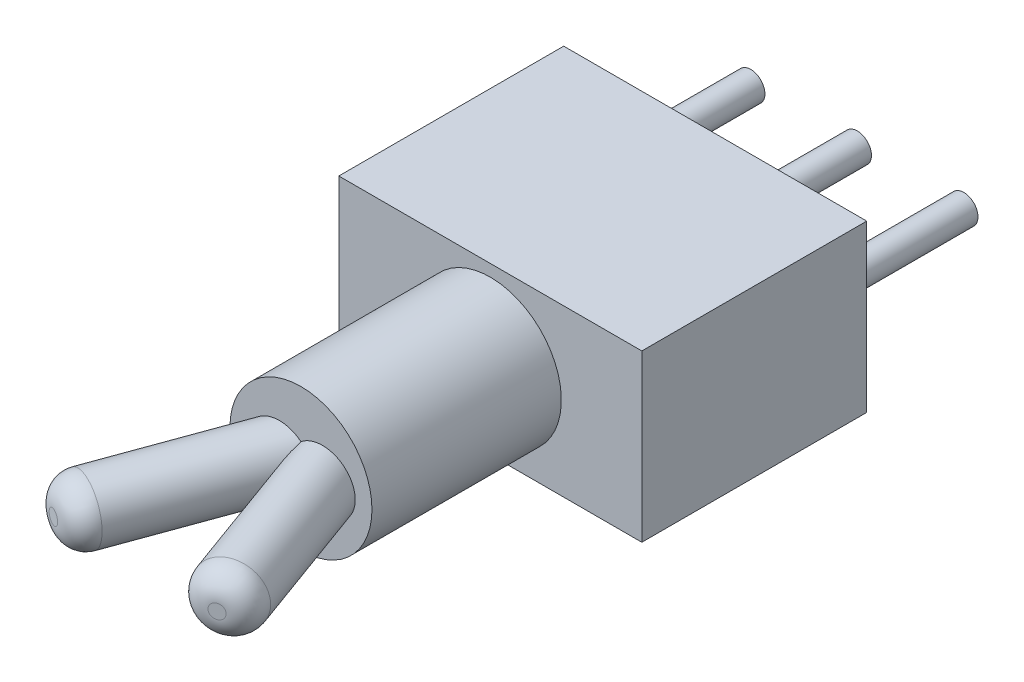
ISO-10303-21;
HEADER;
FILE_DESCRIPTION(('STEP AP214'),'2;1');
FILE_NAME('part.step','',(''),(''),'','','');
FILE_SCHEMA(('AUTOMOTIVE_DESIGN { 1 0 10303 214 1 1 1 1 }'));
ENDSEC;
DATA;
#1=APPLICATION_CONTEXT('core data for automotive mechanical design processes');
#2=APPLICATION_PROTOCOL_DEFINITION('international standard','automotive_design',2000,#1);
#3=PRODUCT_CONTEXT('',#1,'mechanical');
#4=PRODUCT('Part','Part','',(#3));
#5=PRODUCT_RELATED_PRODUCT_CATEGORY('part','',(#4));
#6=PRODUCT_DEFINITION_FORMATION('','',#4);
#7=PRODUCT_DEFINITION_CONTEXT('part definition',#1,'design');
#8=PRODUCT_DEFINITION('design','',#6,#7);
#9=PRODUCT_DEFINITION_SHAPE('','',#8);
#10=(LENGTH_UNIT() NAMED_UNIT(*) SI_UNIT(.MILLI.,.METRE.));
#11=(NAMED_UNIT(*) PLANE_ANGLE_UNIT() SI_UNIT($,.RADIAN.));
#12=(NAMED_UNIT(*) SI_UNIT($,.STERADIAN.) SOLID_ANGLE_UNIT());
#13=UNCERTAINTY_MEASURE_WITH_UNIT(LENGTH_MEASURE(1.E-05),#10,'distance_accuracy_value','');
#14=(GEOMETRIC_REPRESENTATION_CONTEXT(3) GLOBAL_UNCERTAINTY_ASSIGNED_CONTEXT((#13)) GLOBAL_UNIT_ASSIGNED_CONTEXT((#10,
#11,#12)) REPRESENTATION_CONTEXT('',''));
#15=CARTESIAN_POINT('',(0.,0.,0.));
#16=DIRECTION('',(0.,0.,1.));
#17=DIRECTION('',(1.,0.,0.));
#18=AXIS2_PLACEMENT_3D('',#15,#16,#17);
#19=CARTESIAN_POINT('',(-6.4,3.5,-4.75));
#20=DIRECTION('',(0.,0.,1.));
#21=DIRECTION('',(1.,0.,0.));
#22=AXIS2_PLACEMENT_3D('',#19,#20,#21);
#23=PLANE('',#22);
#24=CARTESIAN_POINT('',(4.5,0.,-4.75));
#25=DIRECTION('',(0.,0.,1.));
#26=DIRECTION('',(1.,0.,0.));
#27=AXIS2_PLACEMENT_3D('',#24,#25,#26);
#28=CIRCLE('',#27,0.6);
#29=CARTESIAN_POINT('',(5.1,0.,-4.75));
#30=VERTEX_POINT('',#29);
#31=EDGE_CURVE('E41',#30,#30,#28,.F.);
#32=ORIENTED_EDGE('',*,*,#31,.F.);
#33=EDGE_LOOP('',(#32));
#34=FACE_BOUND('',#33,.T.);
#35=DIRECTION('',(-1.,0.,0.));
#36=VECTOR('',#35,1.);
#37=CARTESIAN_POINT('',(-6.4,-3.5,-4.75));
#38=LINE('',#37,#36);
#39=CARTESIAN_POINT('',(6.4,-3.5,-4.75));
#40=VERTEX_POINT('',#39);
#41=CARTESIAN_POINT('',(-6.4,-3.5,-4.75));
#42=VERTEX_POINT('',#41);
#43=EDGE_CURVE('E129',#40,#42,#38,.T.);
#44=ORIENTED_EDGE('',*,*,#43,.T.);
#45=DIRECTION('',(0.,-1.,0.));
#46=VECTOR('',#45,1.);
#47=CARTESIAN_POINT('',(-6.4,3.5,-4.75));
#48=LINE('',#47,#46);
#49=CARTESIAN_POINT('',(-6.4,3.5,-4.75));
#50=VERTEX_POINT('',#49);
#51=EDGE_CURVE('E349',#50,#42,#48,.T.);
#52=ORIENTED_EDGE('',*,*,#51,.F.);
#53=DIRECTION('',(-1.,0.,0.));
#54=VECTOR('',#53,1.);
#55=CARTESIAN_POINT('',(-6.4,3.5,-4.75));
#56=LINE('',#55,#54);
#57=CARTESIAN_POINT('',(6.4,3.5,-4.75));
#58=VERTEX_POINT('',#57);
#59=EDGE_CURVE('E85',#58,#50,#56,.T.);
#60=ORIENTED_EDGE('',*,*,#59,.F.);
#61=DIRECTION('',(0.,-1.,0.));
#62=VECTOR('',#61,1.);
#63=CARTESIAN_POINT('',(6.4,3.5,-4.75));
#64=LINE('',#63,#62);
#65=EDGE_CURVE('E108',#58,#40,#64,.T.);
#66=ORIENTED_EDGE('',*,*,#65,.T.);
#67=EDGE_LOOP('',(#44,#52,#60,#66));
#68=FACE_BOUND('',#67,.T.);
#69=CARTESIAN_POINT('',(0.,0.,-4.75));
#70=DIRECTION('',(0.,0.,1.));
#71=DIRECTION('',(1.,0.,0.));
#72=AXIS2_PLACEMENT_3D('',#69,#70,#71);
#73=CIRCLE('',#72,0.6);
#74=CARTESIAN_POINT('',(0.6,0.,-4.75));
#75=VERTEX_POINT('',#74);
#76=EDGE_CURVE('E119',#75,#75,#73,.F.);
#77=ORIENTED_EDGE('',*,*,#76,.F.);
#78=EDGE_LOOP('',(#77));
#79=FACE_BOUND('',#78,.T.);
#80=CARTESIAN_POINT('',(-4.5,0.,-4.75));
#81=DIRECTION('',(0.,0.,1.));
#82=DIRECTION('',(1.,0.,0.));
#83=AXIS2_PLACEMENT_3D('',#80,#81,#82);
#84=CIRCLE('',#83,0.6);
#85=CARTESIAN_POINT('',(-3.9,0.,-4.75));
#86=VERTEX_POINT('',#85);
#87=EDGE_CURVE('E11',#86,#86,#84,.F.);
#88=ORIENTED_EDGE('',*,*,#87,.F.);
#89=EDGE_LOOP('',(#88));
#90=FACE_BOUND('',#89,.T.);
#91=ADVANCED_FACE('F33',(#34,#68,#79,#90),#23,.F.);
#92=CARTESIAN_POINT('',(0.,0.,12.75));
#93=DIRECTION('',(0.,0.,1.));
#94=DIRECTION('',(1.,0.,0.));
#95=AXIS2_PLACEMENT_3D('',#92,#93,#94);
#96=PLANE('',#95);
#97=CARTESIAN_POINT('',(0.,0.,12.75));
#98=DIRECTION('',(0.,0.,1.));
#99=DIRECTION('',(1.,0.,0.));
#100=AXIS2_PLACEMENT_3D('',#97,#98,#99);
#101=CIRCLE('',#100,3.);
#102=CARTESIAN_POINT('',(3.,0.,12.75));
#103=VERTEX_POINT('',#102);
#104=EDGE_CURVE('E98',#103,#103,#101,.T.);
#105=ORIENTED_EDGE('',*,*,#104,.T.);
#106=EDGE_LOOP('',(#105));
#107=FACE_BOUND('',#106,.T.);
#108=CARTESIAN_POINT('',(0.909925585665512,0.,12.75));
#109=DIRECTION('',(0.,0.,1.));
#110=DIRECTION('',(1.,0.,0.));
#111=AXIS2_PLACEMENT_3D('',#108,#109,#110);
#112=ELLIPSE('',#111,1.38343110421869,1.3);
#113=CARTESIAN_POINT('',(0.,-0.979228719322916,12.75));
#114=VERTEX_POINT('',#113);
#115=CARTESIAN_POINT('',(0.,0.979228719322916,12.75));
#116=VERTEX_POINT('',#115);
#117=EDGE_CURVE('E97',#114,#116,#112,.T.);
#118=ORIENTED_EDGE('',*,*,#117,.F.);
#119=CARTESIAN_POINT('',(-0.909925585665512,0.,12.75));
#120=DIRECTION('',(0.,0.,1.));
#121=DIRECTION('',(-1.,0.,0.));
#122=AXIS2_PLACEMENT_3D('',#119,#120,#121);
#123=ELLIPSE('',#122,1.38343110421869,1.3);
#124=EDGE_CURVE('E47',#114,#116,#123,.F.);
#125=ORIENTED_EDGE('',*,*,#124,.T.);
#126=EDGE_LOOP('',(#118,#125));
#127=FACE_BOUND('',#126,.T.);
#128=ADVANCED_FACE('F96',(#107,#127),#96,.T.);
#129=CARTESIAN_POINT('',(0.0375157922722384,0.,10.3530737921409));
#130=DIRECTION('',(0.34202014332567,0.,0.939692620785908));
#131=DIRECTION('',(0.939692620785908,0.,-0.34202014332567));
#132=AXIS2_PLACEMENT_3D('',#129,#130,#131);
#133=CYLINDRICAL_SURFACE('',#132,1.3);
#134=CARTESIAN_POINT('',(3.11569708220327,0.,18.8103073792141));
#135=DIRECTION('',(0.34202014332567,0.,0.939692620785908));
#136=DIRECTION('',(0.939692620785908,0.,-0.34202014332567));
#137=AXIS2_PLACEMENT_3D('',#134,#135,#136);
#138=CIRCLE('',#137,1.3);
#139=CARTESIAN_POINT('',(4.33729748922495,0.,18.3656811928907));
#140=VERTEX_POINT('',#139);
#141=EDGE_CURVE('E93',#140,#140,#138,.F.);
#142=ORIENTED_EDGE('',*,*,#141,.T.);
#143=EDGE_LOOP('',(#142));
#144=FACE_BOUND('',#143,.T.);
#145=ORIENTED_EDGE('',*,*,#117,.T.);
#146=CARTESIAN_POINT('',(0.,0.,10.25));
#147=DIRECTION('',(1.,0.,0.));
#148=DIRECTION('',(0.,0.,1.));
#149=AXIS2_PLACEMENT_3D('',#146,#147,#148);
#150=ELLIPSE('',#149,3.80094572021199,1.3);
#151=EDGE_CURVE('E87',#116,#114,#150,.T.);
#152=ORIENTED_EDGE('',*,*,#151,.T.);
#153=EDGE_LOOP('',(#145,#152));
#154=FACE_BOUND('',#153,.T.);
#155=ADVANCED_FACE('F101',(#144,#154),#133,.T.);
#156=CARTESIAN_POINT('',(-6.4,3.5,4.75));
#157=DIRECTION('',(0.,0.,-1.));
#158=DIRECTION('',(-1.,0.,0.));
#159=AXIS2_PLACEMENT_3D('',#156,#157,#158);
#160=PLANE('',#159);
#161=DIRECTION('',(1.,0.,0.));
#162=VECTOR('',#161,1.);
#163=CARTESIAN_POINT('',(-6.4,-3.5,4.75));
#164=LINE('',#163,#162);
#165=CARTESIAN_POINT('',(-6.4,-3.5,4.75));
#166=VERTEX_POINT('',#165);
#167=CARTESIAN_POINT('',(6.4,-3.5,4.75));
#168=VERTEX_POINT('',#167);
#169=EDGE_CURVE('E77',#166,#168,#164,.T.);
#170=ORIENTED_EDGE('',*,*,#169,.T.);
#171=DIRECTION('',(0.,-1.,0.));
#172=VECTOR('',#171,1.);
#173=CARTESIAN_POINT('',(6.4,3.5,4.75));
#174=LINE('',#173,#172);
#175=CARTESIAN_POINT('',(6.4,3.5,4.75));
#176=VERTEX_POINT('',#175);
#177=EDGE_CURVE('E334',#176,#168,#174,.T.);
#178=ORIENTED_EDGE('',*,*,#177,.F.);
#179=DIRECTION('',(1.,0.,0.));
#180=VECTOR('',#179,1.);
#181=CARTESIAN_POINT('',(-6.4,3.5,4.75));
#182=LINE('',#181,#180);
#183=CARTESIAN_POINT('',(-6.4,3.5,4.75));
#184=VERTEX_POINT('',#183);
#185=EDGE_CURVE('E56',#184,#176,#182,.T.);
#186=ORIENTED_EDGE('',*,*,#185,.F.);
#187=DIRECTION('',(0.,-1.,0.));
#188=VECTOR('',#187,1.);
#189=CARTESIAN_POINT('',(-6.4,3.5,4.75));
#190=LINE('',#189,#188);
#191=EDGE_CURVE('E347',#184,#166,#190,.T.);
#192=ORIENTED_EDGE('',*,*,#191,.T.);
#193=EDGE_LOOP('',(#170,#178,#186,#192));
#194=FACE_BOUND('',#193,.T.);
#195=CARTESIAN_POINT('',(0.,0.,4.75));
#196=DIRECTION('',(0.,0.,-1.));
#197=DIRECTION('',(-1.,0.,0.));
#198=AXIS2_PLACEMENT_3D('',#195,#196,#197);
#199=CIRCLE('',#198,3.);
#200=CARTESIAN_POINT('',(-3.,0.,4.75));
#201=VERTEX_POINT('',#200);
#202=EDGE_CURVE('E103',#201,#201,#199,.F.);
#203=ORIENTED_EDGE('',*,*,#202,.F.);
#204=EDGE_LOOP('',(#203));
#205=FACE_BOUND('',#204,.T.);
#206=ADVANCED_FACE('F177',(#194,#205),#160,.F.);
#207=CARTESIAN_POINT('',(6.4,3.5,-4.75));
#208=DIRECTION('',(-1.,0.,0.));
#209=DIRECTION('',(0.,0.,1.));
#210=AXIS2_PLACEMENT_3D('',#207,#208,#209);
#211=PLANE('',#210);
#212=DIRECTION('',(0.,0.,-1.));
#213=VECTOR('',#212,1.);
#214=CARTESIAN_POINT('',(6.4,-3.5,-4.75));
#215=LINE('',#214,#213);
#216=EDGE_CURVE('E332',#168,#40,#215,.T.);
#217=ORIENTED_EDGE('',*,*,#216,.T.);
#218=ORIENTED_EDGE('',*,*,#65,.F.);
#219=DIRECTION('',(0.,0.,-1.));
#220=VECTOR('',#219,1.);
#221=CARTESIAN_POINT('',(6.4,3.5,-4.75));
#222=LINE('',#221,#220);
#223=EDGE_CURVE('E345',#176,#58,#222,.T.);
#224=ORIENTED_EDGE('',*,*,#223,.F.);
#225=ORIENTED_EDGE('',*,*,#177,.T.);
#226=EDGE_LOOP('',(#217,#218,#224,#225));
#227=FACE_BOUND('',#226,.T.);
#228=ADVANCED_FACE('F195',(#227),#211,.F.);
#229=CARTESIAN_POINT('',(-6.4,3.5,-4.75));
#230=DIRECTION('',(1.,0.,0.));
#231=DIRECTION('',(0.,0.,-1.));
#232=AXIS2_PLACEMENT_3D('',#229,#230,#231);
#233=PLANE('',#232);
#234=DIRECTION('',(0.,0.,1.));
#235=VECTOR('',#234,1.);
#236=CARTESIAN_POINT('',(-6.4,-3.5,-4.75));
#237=LINE('',#236,#235);
#238=EDGE_CURVE('E336',#42,#166,#237,.T.);
#239=ORIENTED_EDGE('',*,*,#238,.T.);
#240=ORIENTED_EDGE('',*,*,#191,.F.);
#241=DIRECTION('',(0.,0.,1.));
#242=VECTOR('',#241,1.);
#243=CARTESIAN_POINT('',(-6.4,3.5,-4.75));
#244=LINE('',#243,#242);
#245=EDGE_CURVE('E353',#50,#184,#244,.T.);
#246=ORIENTED_EDGE('',*,*,#245,.F.);
#247=ORIENTED_EDGE('',*,*,#51,.T.);
#248=EDGE_LOOP('',(#239,#240,#246,#247));
#249=FACE_BOUND('',#248,.T.);
#250=ADVANCED_FACE('F189',(#249),#233,.F.);
#251=CARTESIAN_POINT('',(0.,3.5,0.));
#252=DIRECTION('',(0.,1.,0.));
#253=DIRECTION('',(0.,0.,1.));
#254=AXIS2_PLACEMENT_3D('',#251,#252,#253);
#255=PLANE('',#254);
#256=ORIENTED_EDGE('',*,*,#223,.T.);
#257=ORIENTED_EDGE('',*,*,#59,.T.);
#258=ORIENTED_EDGE('',*,*,#245,.T.);
#259=ORIENTED_EDGE('',*,*,#185,.T.);
#260=EDGE_LOOP('',(#256,#257,#258,#259));
#261=FACE_BOUND('',#260,.T.);
#262=ADVANCED_FACE('F186',(#261),#255,.T.);
#263=CARTESIAN_POINT('',(0.,-3.5,0.));
#264=DIRECTION('',(0.,1.,0.));
#265=DIRECTION('',(0.,0.,1.));
#266=AXIS2_PLACEMENT_3D('',#263,#264,#265);
#267=PLANE('',#266);
#268=ORIENTED_EDGE('',*,*,#216,.F.);
#269=ORIENTED_EDGE('',*,*,#169,.F.);
#270=ORIENTED_EDGE('',*,*,#238,.F.);
#271=ORIENTED_EDGE('',*,*,#43,.F.);
#272=EDGE_LOOP('',(#268,#269,#270,#271));
#273=FACE_BOUND('',#272,.T.);
#274=ADVANCED_FACE('F184',(#273),#267,.F.);
#275=CARTESIAN_POINT('',(0.,0.,12.75));
#276=DIRECTION('',(0.,0.,-1.));
#277=DIRECTION('',(-1.,0.,0.));
#278=AXIS2_PLACEMENT_3D('',#275,#276,#277);
#279=CYLINDRICAL_SURFACE('',#278,3.);
#280=ORIENTED_EDGE('',*,*,#104,.F.);
#281=EDGE_LOOP('',(#280));
#282=FACE_BOUND('',#281,.T.);
#283=ORIENTED_EDGE('',*,*,#202,.T.);
#284=EDGE_LOOP('',(#283));
#285=FACE_BOUND('',#284,.T.);
#286=ADVANCED_FACE('F173',(#282,#285),#279,.T.);
#287=CARTESIAN_POINT('',(3.45771722552894,0.,19.75));
#288=DIRECTION('',(0.34202014332567,0.,0.939692620785908));
#289=DIRECTION('',(0.939692620785908,0.,-0.34202014332567));
#290=AXIS2_PLACEMENT_3D('',#287,#288,#289);
#291=PLANE('',#290);
#292=CARTESIAN_POINT('',(3.45771722552894,0.,19.75));
#293=DIRECTION('',(0.34202014332567,0.,0.939692620785908));
#294=DIRECTION('',(0.939692620785908,0.,-0.34202014332567));
#295=AXIS2_PLACEMENT_3D('',#292,#293,#294);
#296=CIRCLE('',#295,0.3);
#297=CARTESIAN_POINT('',(3.73962501176472,0.,19.6473939570023));
#298=VERTEX_POINT('',#297);
#299=EDGE_CURVE('E102',#298,#298,#296,.T.);
#300=ORIENTED_EDGE('',*,*,#299,.T.);
#301=EDGE_LOOP('',(#300));
#302=FACE_BOUND('',#301,.T.);
#303=ADVANCED_FACE('F170',(#302),#291,.T.);
#304=CARTESIAN_POINT('',(3.11569708220327,0.,18.8103073792141));
#305=DIRECTION('',(0.34202014332567,0.,0.939692620785908));
#306=DIRECTION('',(0.939692620785908,0.,-0.34202014332567));
#307=AXIS2_PLACEMENT_3D('',#304,#305,#306);
#308=DEGENERATE_TOROIDAL_SURFACE('',#307,0.3,1.,.T.);
#309=ORIENTED_EDGE('',*,*,#141,.F.);
#310=EDGE_LOOP('',(#309));
#311=FACE_BOUND('',#310,.T.);
#312=ORIENTED_EDGE('',*,*,#299,.F.);
#313=EDGE_LOOP('',(#312));
#314=FACE_BOUND('',#313,.T.);
#315=ADVANCED_FACE('F168',(#311,#314),#308,.T.);
#316=CARTESIAN_POINT('',(-0.0375157922722384,0.,10.3530737921409));
#317=DIRECTION('',(-0.34202014332567,0.,0.939692620785908));
#318=DIRECTION('',(0.939692620785908,0.,0.34202014332567));
#319=AXIS2_PLACEMENT_3D('',#316,#317,#318);
#320=CYLINDRICAL_SURFACE('',#319,1.3);
#321=CARTESIAN_POINT('',(-3.11569708220327,0.,18.8103073792141));
#322=DIRECTION('',(-0.34202014332567,0.,0.939692620785908));
#323=DIRECTION('',(0.939692620785908,0.,0.34202014332567));
#324=AXIS2_PLACEMENT_3D('',#321,#322,#323);
#325=CIRCLE('',#324,1.3);
#326=CARTESIAN_POINT('',(-1.89409667518159,0.,19.2549335655375));
#327=VERTEX_POINT('',#326);
#328=EDGE_CURVE('E92',#327,#327,#325,.F.);
#329=ORIENTED_EDGE('',*,*,#328,.T.);
#330=EDGE_LOOP('',(#329));
#331=FACE_BOUND('',#330,.T.);
#332=ORIENTED_EDGE('',*,*,#124,.F.);
#333=ORIENTED_EDGE('',*,*,#151,.F.);
#334=EDGE_LOOP('',(#332,#333));
#335=FACE_BOUND('',#334,.T.);
#336=ADVANCED_FACE('F88',(#331,#335),#320,.T.);
#337=CARTESIAN_POINT('',(-3.45771722552894,0.,19.75));
#338=DIRECTION('',(-0.34202014332567,0.,0.939692620785908));
#339=DIRECTION('',(-0.939692620785908,0.,-0.34202014332567));
#340=AXIS2_PLACEMENT_3D('',#337,#338,#339);
#341=PLANE('',#340);
#342=CARTESIAN_POINT('',(-3.45771722552894,0.,19.75));
#343=DIRECTION('',(-0.34202014332567,0.,0.939692620785908));
#344=DIRECTION('',(0.939692620785908,0.,0.34202014332567));
#345=AXIS2_PLACEMENT_3D('',#342,#343,#344);
#346=CIRCLE('',#345,0.3);
#347=CARTESIAN_POINT('',(-3.17580943929317,0.,19.8526060429977));
#348=VERTEX_POINT('',#347);
#349=EDGE_CURVE('E116',#348,#348,#346,.T.);
#350=ORIENTED_EDGE('',*,*,#349,.T.);
#351=EDGE_LOOP('',(#350));
#352=FACE_BOUND('',#351,.T.);
#353=ADVANCED_FACE('F162',(#352),#341,.T.);
#354=CARTESIAN_POINT('',(-3.11569708220327,0.,18.8103073792141));
#355=DIRECTION('',(-0.34202014332567,0.,0.939692620785908));
#356=DIRECTION('',(0.939692620785908,0.,0.34202014332567));
#357=AXIS2_PLACEMENT_3D('',#354,#355,#356);
#358=DEGENERATE_TOROIDAL_SURFACE('',#357,0.3,1.,.T.);
#359=ORIENTED_EDGE('',*,*,#349,.F.);
#360=EDGE_LOOP('',(#359));
#361=FACE_BOUND('',#360,.T.);
#362=ORIENTED_EDGE('',*,*,#328,.F.);
#363=EDGE_LOOP('',(#362));
#364=FACE_BOUND('',#363,.T.);
#365=ADVANCED_FACE('F35',(#361,#364),#358,.T.);
#366=CARTESIAN_POINT('',(0.,0.,-10.75));
#367=DIRECTION('',(0.,0.,1.));
#368=DIRECTION('',(1.,0.,0.));
#369=AXIS2_PLACEMENT_3D('',#366,#367,#368);
#370=CYLINDRICAL_SURFACE('',#369,0.6);
#371=CARTESIAN_POINT('',(0.,0.,-10.75));
#372=DIRECTION('',(0.,0.,-1.));
#373=DIRECTION('',(-1.,0.,0.));
#374=AXIS2_PLACEMENT_3D('',#371,#372,#373);
#375=CIRCLE('',#374,0.6);
#376=CARTESIAN_POINT('',(-0.6,0.,-10.75));
#377=VERTEX_POINT('',#376);
#378=EDGE_CURVE('E99',#377,#377,#375,.T.);
#379=ORIENTED_EDGE('',*,*,#378,.F.);
#380=EDGE_LOOP('',(#379));
#381=FACE_BOUND('',#380,.T.);
#382=ORIENTED_EDGE('',*,*,#76,.T.);
#383=EDGE_LOOP('',(#382));
#384=FACE_BOUND('',#383,.T.);
#385=ADVANCED_FACE('F157',(#381,#384),#370,.T.);
#386=CARTESIAN_POINT('',(0.,0.,-10.75));
#387=DIRECTION('',(0.,0.,-1.));
#388=DIRECTION('',(-1.,0.,0.));
#389=AXIS2_PLACEMENT_3D('',#386,#387,#388);
#390=PLANE('',#389);
#391=ORIENTED_EDGE('',*,*,#378,.T.);
#392=EDGE_LOOP('',(#391));
#393=FACE_BOUND('',#392,.T.);
#394=ADVANCED_FACE('F153',(#393),#390,.T.);
#395=CARTESIAN_POINT('',(4.5,0.,-10.75));
#396=DIRECTION('',(0.,0.,1.));
#397=DIRECTION('',(1.,0.,0.));
#398=AXIS2_PLACEMENT_3D('',#395,#396,#397);
#399=CYLINDRICAL_SURFACE('',#398,0.6);
#400=CARTESIAN_POINT('',(4.5,0.,-10.75));
#401=DIRECTION('',(0.,0.,-1.));
#402=DIRECTION('',(-1.,0.,0.));
#403=AXIS2_PLACEMENT_3D('',#400,#401,#402);
#404=CIRCLE('',#403,0.6);
#405=CARTESIAN_POINT('',(3.9,0.,-10.75));
#406=VERTEX_POINT('',#405);
#407=EDGE_CURVE('E359',#406,#406,#404,.T.);
#408=ORIENTED_EDGE('',*,*,#407,.F.);
#409=EDGE_LOOP('',(#408));
#410=FACE_BOUND('',#409,.T.);
#411=ORIENTED_EDGE('',*,*,#31,.T.);
#412=EDGE_LOOP('',(#411));
#413=FACE_BOUND('',#412,.T.);
#414=ADVANCED_FACE('F124',(#410,#413),#399,.T.);
#415=CARTESIAN_POINT('',(4.5,0.,-10.75));
#416=DIRECTION('',(0.,0.,-1.));
#417=DIRECTION('',(-1.,0.,0.));
#418=AXIS2_PLACEMENT_3D('',#415,#416,#417);
#419=PLANE('',#418);
#420=ORIENTED_EDGE('',*,*,#407,.T.);
#421=EDGE_LOOP('',(#420));
#422=FACE_BOUND('',#421,.T.);
#423=ADVANCED_FACE('F138',(#422),#419,.T.);
#424=CARTESIAN_POINT('',(-4.5,0.,-10.75));
#425=DIRECTION('',(0.,0.,1.));
#426=DIRECTION('',(1.,0.,0.));
#427=AXIS2_PLACEMENT_3D('',#424,#425,#426);
#428=CYLINDRICAL_SURFACE('',#427,0.6);
#429=CARTESIAN_POINT('',(-4.5,0.,-10.75));
#430=DIRECTION('',(0.,0.,-1.));
#431=DIRECTION('',(-1.,0.,0.));
#432=AXIS2_PLACEMENT_3D('',#429,#430,#431);
#433=CIRCLE('',#432,0.6);
#434=CARTESIAN_POINT('',(-5.1,0.,-10.75));
#435=VERTEX_POINT('',#434);
#436=EDGE_CURVE('E362',#435,#435,#433,.T.);
#437=ORIENTED_EDGE('',*,*,#436,.F.);
#438=EDGE_LOOP('',(#437));
#439=FACE_BOUND('',#438,.T.);
#440=ORIENTED_EDGE('',*,*,#87,.T.);
#441=EDGE_LOOP('',(#440));
#442=FACE_BOUND('',#441,.T.);
#443=ADVANCED_FACE('F135',(#439,#442),#428,.T.);
#444=CARTESIAN_POINT('',(-4.5,0.,-10.75));
#445=DIRECTION('',(0.,0.,-1.));
#446=DIRECTION('',(-1.,0.,0.));
#447=AXIS2_PLACEMENT_3D('',#444,#445,#446);
#448=PLANE('',#447);
#449=ORIENTED_EDGE('',*,*,#436,.T.);
#450=EDGE_LOOP('',(#449));
#451=FACE_BOUND('',#450,.T.);
#452=ADVANCED_FACE('F137',(#451),#448,.T.);
#453=CLOSED_SHELL('',(#91,#128,#155,#206,#228,#250,#262,#274,#286,#303,#315,#336,#353,#365,#385,
#394,#414,#423,#443,#452));
#454=MANIFOLD_SOLID_BREP('B2',#453);
#455=ADVANCED_BREP_SHAPE_REPRESENTATION('',(#18,#454),#14);
#456=SHAPE_DEFINITION_REPRESENTATION(#9,#455);
ENDSEC;
END-ISO-10303-21;
